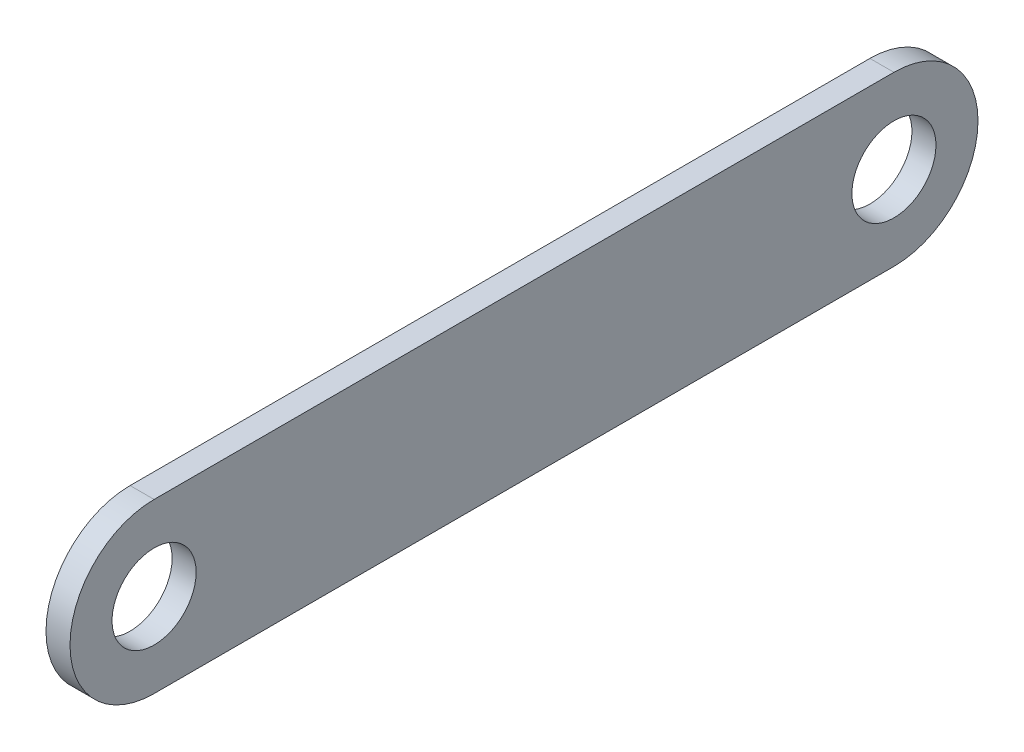
ISO-10303-21;
HEADER;
FILE_DESCRIPTION(('STEP AP214'),'2;1');
FILE_NAME('part.step','',(''),(''),'','','');
FILE_SCHEMA(('AUTOMOTIVE_DESIGN { 1 0 10303 214 1 1 1 1 }'));
ENDSEC;
DATA;
#1=APPLICATION_CONTEXT('core data for automotive mechanical design processes');
#2=APPLICATION_PROTOCOL_DEFINITION('international standard','automotive_design',2000,#1);
#3=PRODUCT_CONTEXT('',#1,'mechanical');
#4=PRODUCT('Part','Part','',(#3));
#5=PRODUCT_RELATED_PRODUCT_CATEGORY('part','',(#4));
#6=PRODUCT_DEFINITION_FORMATION('','',#4);
#7=PRODUCT_DEFINITION_CONTEXT('part definition',#1,'design');
#8=PRODUCT_DEFINITION('design','',#6,#7);
#9=PRODUCT_DEFINITION_SHAPE('','',#8);
#10=(LENGTH_UNIT() NAMED_UNIT(*) SI_UNIT(.MILLI.,.METRE.));
#11=(NAMED_UNIT(*) PLANE_ANGLE_UNIT() SI_UNIT($,.RADIAN.));
#12=(NAMED_UNIT(*) SI_UNIT($,.STERADIAN.) SOLID_ANGLE_UNIT());
#13=UNCERTAINTY_MEASURE_WITH_UNIT(LENGTH_MEASURE(1.E-05),#10,'distance_accuracy_value','');
#14=(GEOMETRIC_REPRESENTATION_CONTEXT(3) GLOBAL_UNCERTAINTY_ASSIGNED_CONTEXT((#13)) GLOBAL_UNIT_ASSIGNED_CONTEXT((#10,
#11,#12)) REPRESENTATION_CONTEXT('',''));
#15=CARTESIAN_POINT('',(0.,0.,0.));
#16=DIRECTION('',(0.,0.,1.));
#17=DIRECTION('',(1.,0.,0.));
#18=AXIS2_PLACEMENT_3D('',#15,#16,#17);
#19=CARTESIAN_POINT('',(10.,0.,-308.));
#20=DIRECTION('',(1.,0.,0.));
#21=DIRECTION('',(0.,0.,-1.));
#22=AXIS2_PLACEMENT_3D('',#19,#20,#21);
#23=PLANE('',#22);
#24=CARTESIAN_POINT('',(10.,0.,0.));
#25=DIRECTION('',(1.,0.,0.));
#26=DIRECTION('',(0.,0.,-1.));
#27=AXIS2_PLACEMENT_3D('',#24,#25,#26);
#28=CIRCLE('',#27,17.5);
#29=CARTESIAN_POINT('',(10.,0.,-17.5));
#30=VERTEX_POINT('',#29);
#31=EDGE_CURVE('E130',#30,#30,#28,.T.);
#32=ORIENTED_EDGE('',*,*,#31,.F.);
#33=EDGE_LOOP('',(#32));
#34=FACE_BOUND('',#33,.T.);
#35=CARTESIAN_POINT('',(10.,0.,-308.));
#36=DIRECTION('',(1.,0.,0.));
#37=DIRECTION('',(0.,0.,-1.));
#38=AXIS2_PLACEMENT_3D('',#35,#36,#37);
#39=CIRCLE('',#38,35.);
#40=CARTESIAN_POINT('',(10.,-35.,-308.));
#41=VERTEX_POINT('',#40);
#42=CARTESIAN_POINT('',(10.,35.,-308.));
#43=VERTEX_POINT('',#42);
#44=EDGE_CURVE('E114',#41,#43,#39,.T.);
#45=ORIENTED_EDGE('',*,*,#44,.T.);
#46=DIRECTION('',(0.,0.,1.));
#47=VECTOR('',#46,1.);
#48=CARTESIAN_POINT('',(10.,35.,-308.));
#49=LINE('',#48,#47);
#50=CARTESIAN_POINT('',(10.,35.,0.));
#51=VERTEX_POINT('',#50);
#52=EDGE_CURVE('E107',#43,#51,#49,.T.);
#53=ORIENTED_EDGE('',*,*,#52,.T.);
#54=CARTESIAN_POINT('',(10.,0.,0.));
#55=DIRECTION('',(1.,0.,0.));
#56=DIRECTION('',(0.,0.,-1.));
#57=AXIS2_PLACEMENT_3D('',#54,#55,#56);
#58=CIRCLE('',#57,35.);
#59=CARTESIAN_POINT('',(10.,-35.,0.));
#60=VERTEX_POINT('',#59);
#61=EDGE_CURVE('E113',#51,#60,#58,.T.);
#62=ORIENTED_EDGE('',*,*,#61,.T.);
#63=DIRECTION('',(0.,0.,1.));
#64=VECTOR('',#63,1.);
#65=CARTESIAN_POINT('',(10.,-35.,-308.));
#66=LINE('',#65,#64);
#67=EDGE_CURVE('E123',#41,#60,#66,.T.);
#68=ORIENTED_EDGE('',*,*,#67,.F.);
#69=EDGE_LOOP('',(#45,#53,#62,#68));
#70=FACE_BOUND('',#69,.T.);
#71=CARTESIAN_POINT('',(10.,0.,-308.));
#72=DIRECTION('',(1.,0.,0.));
#73=DIRECTION('',(0.,0.,-1.));
#74=AXIS2_PLACEMENT_3D('',#71,#72,#73);
#75=CIRCLE('',#74,17.5);
#76=CARTESIAN_POINT('',(10.,0.,-325.5));
#77=VERTEX_POINT('',#76);
#78=EDGE_CURVE('E143',#77,#77,#75,.T.);
#79=ORIENTED_EDGE('',*,*,#78,.F.);
#80=EDGE_LOOP('',(#79));
#81=FACE_BOUND('',#80,.T.);
#82=ADVANCED_FACE('F64',(#34,#70,#81),#23,.T.);
#83=CARTESIAN_POINT('',(0.,0.,-308.));
#84=DIRECTION('',(1.,0.,0.));
#85=DIRECTION('',(0.,0.,-1.));
#86=AXIS2_PLACEMENT_3D('',#83,#84,#85);
#87=PLANE('',#86);
#88=CARTESIAN_POINT('',(0.,0.,-308.));
#89=DIRECTION('',(1.,0.,0.));
#90=DIRECTION('',(0.,0.,-1.));
#91=AXIS2_PLACEMENT_3D('',#88,#89,#90);
#92=CIRCLE('',#91,35.);
#93=CARTESIAN_POINT('',(0.,-35.,-308.));
#94=VERTEX_POINT('',#93);
#95=CARTESIAN_POINT('',(0.,35.,-308.));
#96=VERTEX_POINT('',#95);
#97=EDGE_CURVE('E128',#94,#96,#92,.T.);
#98=ORIENTED_EDGE('',*,*,#97,.F.);
#99=DIRECTION('',(0.,0.,1.));
#100=VECTOR('',#99,1.);
#101=CARTESIAN_POINT('',(0.,-35.,-308.));
#102=LINE('',#101,#100);
#103=CARTESIAN_POINT('',(0.,-35.,0.));
#104=VERTEX_POINT('',#103);
#105=EDGE_CURVE('E134',#94,#104,#102,.T.);
#106=ORIENTED_EDGE('',*,*,#105,.T.);
#107=CARTESIAN_POINT('',(0.,0.,0.));
#108=DIRECTION('',(1.,0.,0.));
#109=DIRECTION('',(0.,0.,-1.));
#110=AXIS2_PLACEMENT_3D('',#107,#108,#109);
#111=CIRCLE('',#110,35.);
#112=CARTESIAN_POINT('',(0.,35.,0.));
#113=VERTEX_POINT('',#112);
#114=EDGE_CURVE('E132',#113,#104,#111,.T.);
#115=ORIENTED_EDGE('',*,*,#114,.F.);
#116=DIRECTION('',(0.,0.,1.));
#117=VECTOR('',#116,1.);
#118=CARTESIAN_POINT('',(0.,35.,-308.));
#119=LINE('',#118,#117);
#120=EDGE_CURVE('E119',#96,#113,#119,.T.);
#121=ORIENTED_EDGE('',*,*,#120,.F.);
#122=EDGE_LOOP('',(#98,#106,#115,#121));
#123=FACE_BOUND('',#122,.T.);
#124=CARTESIAN_POINT('',(0.,0.,0.));
#125=DIRECTION('',(1.,0.,0.));
#126=DIRECTION('',(0.,0.,-1.));
#127=AXIS2_PLACEMENT_3D('',#124,#125,#126);
#128=CIRCLE('',#127,17.5);
#129=CARTESIAN_POINT('',(0.,0.,-17.5));
#130=VERTEX_POINT('',#129);
#131=EDGE_CURVE('E140',#130,#130,#128,.T.);
#132=ORIENTED_EDGE('',*,*,#131,.T.);
#133=EDGE_LOOP('',(#132));
#134=FACE_BOUND('',#133,.T.);
#135=CARTESIAN_POINT('',(0.,0.,-308.));
#136=DIRECTION('',(1.,0.,0.));
#137=DIRECTION('',(0.,0.,-1.));
#138=AXIS2_PLACEMENT_3D('',#135,#136,#137);
#139=CIRCLE('',#138,17.5);
#140=CARTESIAN_POINT('',(0.,0.,-325.5));
#141=VERTEX_POINT('',#140);
#142=EDGE_CURVE('E146',#141,#141,#139,.T.);
#143=ORIENTED_EDGE('',*,*,#142,.T.);
#144=EDGE_LOOP('',(#143));
#145=FACE_BOUND('',#144,.T.);
#146=ADVANCED_FACE('F155',(#123,#134,#145),#87,.F.);
#147=CARTESIAN_POINT('',(10.,0.,-308.));
#148=DIRECTION('',(-1.,0.,0.));
#149=DIRECTION('',(0.,0.,1.));
#150=AXIS2_PLACEMENT_3D('',#147,#148,#149);
#151=CYLINDRICAL_SURFACE('',#150,35.);
#152=ORIENTED_EDGE('',*,*,#97,.T.);
#153=DIRECTION('',(-1.,0.,0.));
#154=VECTOR('',#153,1.);
#155=CARTESIAN_POINT('',(10.,35.,-308.));
#156=LINE('',#155,#154);
#157=EDGE_CURVE('E12',#43,#96,#156,.T.);
#158=ORIENTED_EDGE('',*,*,#157,.F.);
#159=ORIENTED_EDGE('',*,*,#44,.F.);
#160=DIRECTION('',(-1.,0.,0.));
#161=VECTOR('',#160,1.);
#162=CARTESIAN_POINT('',(10.,-35.,-308.));
#163=LINE('',#162,#161);
#164=EDGE_CURVE('E81',#41,#94,#163,.T.);
#165=ORIENTED_EDGE('',*,*,#164,.T.);
#166=EDGE_LOOP('',(#152,#158,#159,#165));
#167=FACE_BOUND('',#166,.T.);
#168=ADVANCED_FACE('F66',(#167),#151,.T.);
#169=CARTESIAN_POINT('',(10.,35.,-308.));
#170=DIRECTION('',(0.,-1.,0.));
#171=DIRECTION('',(0.,0.,-1.));
#172=AXIS2_PLACEMENT_3D('',#169,#170,#171);
#173=PLANE('',#172);
#174=ORIENTED_EDGE('',*,*,#120,.T.);
#175=DIRECTION('',(-1.,0.,0.));
#176=VECTOR('',#175,1.);
#177=CARTESIAN_POINT('',(10.,35.,0.));
#178=LINE('',#177,#176);
#179=EDGE_CURVE('E73',#51,#113,#178,.T.);
#180=ORIENTED_EDGE('',*,*,#179,.F.);
#181=ORIENTED_EDGE('',*,*,#52,.F.);
#182=ORIENTED_EDGE('',*,*,#157,.T.);
#183=EDGE_LOOP('',(#174,#180,#181,#182));
#184=FACE_BOUND('',#183,.T.);
#185=ADVANCED_FACE('F118',(#184),#173,.F.);
#186=CARTESIAN_POINT('',(10.,0.,0.));
#187=DIRECTION('',(-1.,0.,0.));
#188=DIRECTION('',(0.,0.,1.));
#189=AXIS2_PLACEMENT_3D('',#186,#187,#188);
#190=CYLINDRICAL_SURFACE('',#189,35.);
#191=ORIENTED_EDGE('',*,*,#114,.T.);
#192=DIRECTION('',(-1.,0.,0.));
#193=VECTOR('',#192,1.);
#194=CARTESIAN_POINT('',(10.,-35.,0.));
#195=LINE('',#194,#193);
#196=EDGE_CURVE('E96',#60,#104,#195,.T.);
#197=ORIENTED_EDGE('',*,*,#196,.F.);
#198=ORIENTED_EDGE('',*,*,#61,.F.);
#199=ORIENTED_EDGE('',*,*,#179,.T.);
#200=EDGE_LOOP('',(#191,#197,#198,#199));
#201=FACE_BOUND('',#200,.T.);
#202=ADVANCED_FACE('F122',(#201),#190,.T.);
#203=CARTESIAN_POINT('',(10.,-35.,-308.));
#204=DIRECTION('',(0.,-1.,0.));
#205=DIRECTION('',(0.,0.,-1.));
#206=AXIS2_PLACEMENT_3D('',#203,#204,#205);
#207=PLANE('',#206);
#208=ORIENTED_EDGE('',*,*,#105,.F.);
#209=ORIENTED_EDGE('',*,*,#164,.F.);
#210=ORIENTED_EDGE('',*,*,#67,.T.);
#211=ORIENTED_EDGE('',*,*,#196,.T.);
#212=EDGE_LOOP('',(#208,#209,#210,#211));
#213=FACE_BOUND('',#212,.T.);
#214=ADVANCED_FACE('F167',(#213),#207,.T.);
#215=CARTESIAN_POINT('',(10.,0.,0.));
#216=DIRECTION('',(-1.,0.,0.));
#217=DIRECTION('',(0.,0.,1.));
#218=AXIS2_PLACEMENT_3D('',#215,#216,#217);
#219=CYLINDRICAL_SURFACE('',#218,17.5);
#220=ORIENTED_EDGE('',*,*,#31,.T.);
#221=EDGE_LOOP('',(#220));
#222=FACE_BOUND('',#221,.T.);
#223=ORIENTED_EDGE('',*,*,#131,.F.);
#224=EDGE_LOOP('',(#223));
#225=FACE_BOUND('',#224,.T.);
#226=ADVANCED_FACE('F164',(#222,#225),#219,.F.);
#227=CARTESIAN_POINT('',(10.,0.,-308.));
#228=DIRECTION('',(-1.,0.,0.));
#229=DIRECTION('',(0.,0.,1.));
#230=AXIS2_PLACEMENT_3D('',#227,#228,#229);
#231=CYLINDRICAL_SURFACE('',#230,17.5);
#232=ORIENTED_EDGE('',*,*,#78,.T.);
#233=EDGE_LOOP('',(#232));
#234=FACE_BOUND('',#233,.T.);
#235=ORIENTED_EDGE('',*,*,#142,.F.);
#236=EDGE_LOOP('',(#235));
#237=FACE_BOUND('',#236,.T.);
#238=ADVANCED_FACE('F152',(#234,#237),#231,.F.);
#239=CLOSED_SHELL('',(#82,#146,#168,#185,#202,#214,#226,#238));
#240=MANIFOLD_SOLID_BREP('B2',#239);
#241=ADVANCED_BREP_SHAPE_REPRESENTATION('',(#18,#240),#14);
#242=SHAPE_DEFINITION_REPRESENTATION(#9,#241);
ENDSEC;
END-ISO-10303-21;
